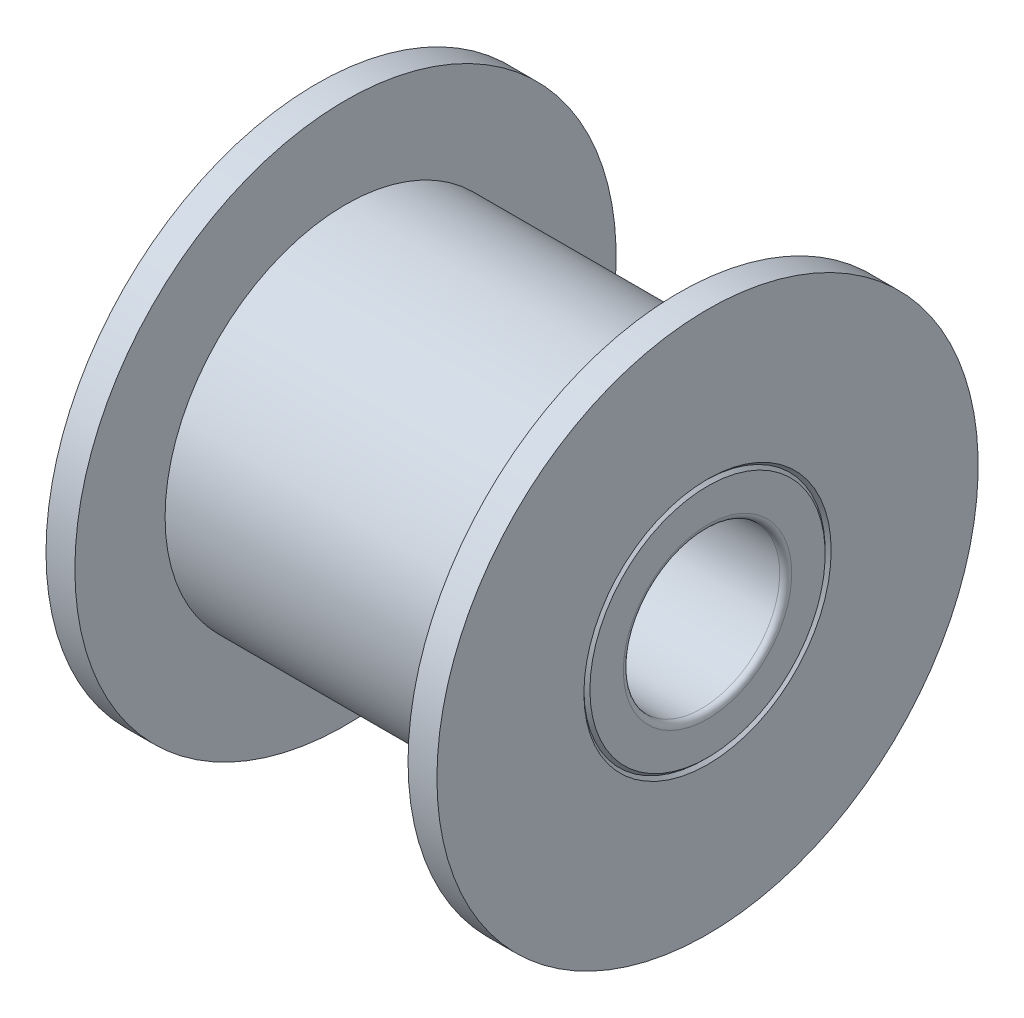
ISO-10303-21;
HEADER;
FILE_DESCRIPTION(('STEP AP214'),'2;1');
FILE_NAME('part.step','',(''),(''),'','','');
FILE_SCHEMA(('AUTOMOTIVE_DESIGN { 1 0 10303 214 1 1 1 1 }'));
ENDSEC;
DATA;
#1=APPLICATION_CONTEXT('core data for automotive mechanical design processes');
#2=APPLICATION_PROTOCOL_DEFINITION('international standard','automotive_design',2000,#1);
#3=PRODUCT_CONTEXT('',#1,'mechanical');
#4=PRODUCT('Part','Part','',(#3));
#5=PRODUCT_RELATED_PRODUCT_CATEGORY('part','',(#4));
#6=PRODUCT_DEFINITION_FORMATION('','',#4);
#7=PRODUCT_DEFINITION_CONTEXT('part definition',#1,'design');
#8=PRODUCT_DEFINITION('design','',#6,#7);
#9=PRODUCT_DEFINITION_SHAPE('','',#8);
#10=(LENGTH_UNIT() NAMED_UNIT(*) SI_UNIT(.MILLI.,.METRE.));
#11=(NAMED_UNIT(*) PLANE_ANGLE_UNIT() SI_UNIT($,.RADIAN.));
#12=(NAMED_UNIT(*) SI_UNIT($,.STERADIAN.) SOLID_ANGLE_UNIT());
#13=UNCERTAINTY_MEASURE_WITH_UNIT(LENGTH_MEASURE(1.E-05),#10,'distance_accuracy_value','');
#14=(GEOMETRIC_REPRESENTATION_CONTEXT(3) GLOBAL_UNCERTAINTY_ASSIGNED_CONTEXT((#13)) GLOBAL_UNIT_ASSIGNED_CONTEXT((#10,
#11,#12)) REPRESENTATION_CONTEXT('',''));
#15=CARTESIAN_POINT('',(0.,0.,0.));
#16=DIRECTION('',(0.,0.,1.));
#17=DIRECTION('',(1.,0.,0.));
#18=AXIS2_PLACEMENT_3D('',#15,#16,#17);
#19=CARTESIAN_POINT('',(0.999999999999998,-1.5,0.));
#20=DIRECTION('',(1.,0.,0.));
#21=DIRECTION('',(0.,0.,-1.));
#22=AXIS2_PLACEMENT_3D('',#19,#20,#21);
#23=CONICAL_SURFACE('',#22,3.88821661797057,0.911507190817284);
#24=CARTESIAN_POINT('',(1.08662837584799,-1.5,0.));
#25=DIRECTION('',(-1.,0.,0.));
#26=DIRECTION('',(0.,0.,1.));
#27=AXIS2_PLACEMENT_3D('',#24,#25,#26);
#28=CIRCLE('',#27,4.);
#29=CARTESIAN_POINT('',(1.08662837584799,-1.5,4.));
#30=VERTEX_POINT('',#29);
#31=EDGE_CURVE('E86',#30,#30,#28,.T.);
#32=ORIENTED_EDGE('',*,*,#31,.T.);
#33=EDGE_LOOP('',(#32));
#34=FACE_BOUND('',#33,.T.);
#35=CARTESIAN_POINT('',(0.999999999999998,-1.5,0.));
#36=DIRECTION('',(-1.,0.,0.));
#37=DIRECTION('',(0.,0.,1.));
#38=AXIS2_PLACEMENT_3D('',#35,#36,#37);
#39=CIRCLE('',#38,3.88821661797057);
#40=CARTESIAN_POINT('',(0.999999999999998,-1.5,3.88821661797057));
#41=VERTEX_POINT('',#40);
#42=EDGE_CURVE('E53',#41,#41,#39,.T.);
#43=ORIENTED_EDGE('',*,*,#42,.F.);
#44=EDGE_LOOP('',(#43));
#45=FACE_BOUND('',#44,.T.);
#46=ADVANCED_FACE('F33',(#34,#45),#23,.T.);
#47=CARTESIAN_POINT('',(1.,0.,0.));
#48=DIRECTION('',(1.,0.,0.));
#49=DIRECTION('',(0.,0.,-1.));
#50=AXIS2_PLACEMENT_3D('',#47,#48,#49);
#51=PLANE('',#50);
#52=CARTESIAN_POINT('',(1.,-1.5,0.));
#53=DIRECTION('',(1.,0.,0.));
#54=DIRECTION('',(0.,0.,-1.));
#55=AXIS2_PLACEMENT_3D('',#52,#53,#54);
#56=CIRCLE('',#55,2.8);
#57=CARTESIAN_POINT('',(1.,-1.5,-2.8));
#58=VERTEX_POINT('',#57);
#59=EDGE_CURVE('E10',#58,#58,#56,.T.);
#60=ORIENTED_EDGE('',*,*,#59,.T.);
#61=EDGE_LOOP('',(#60));
#62=FACE_BOUND('',#61,.T.);
#63=ORIENTED_EDGE('',*,*,#42,.T.);
#64=EDGE_LOOP('',(#63));
#65=FACE_BOUND('',#64,.T.);
#66=ADVANCED_FACE('F107',(#62,#65),#51,.F.);
#67=CARTESIAN_POINT('',(0.999999999999999,-1.5,0.));
#68=DIRECTION('',(-1.,0.,0.));
#69=DIRECTION('',(0.,0.,1.));
#70=AXIS2_PLACEMENT_3D('',#67,#68,#69);
#71=CYLINDRICAL_SURFACE('',#70,2.6);
#72=CARTESIAN_POINT('',(13.8,-1.5,0.));
#73=DIRECTION('',(-1.,0.,0.));
#74=DIRECTION('',(0.,0.,1.));
#75=AXIS2_PLACEMENT_3D('',#72,#73,#74);
#76=CIRCLE('',#75,2.6);
#77=CARTESIAN_POINT('',(13.8,-1.5,2.6));
#78=VERTEX_POINT('',#77);
#79=EDGE_CURVE('E40',#78,#78,#76,.F.);
#80=ORIENTED_EDGE('',*,*,#79,.T.);
#81=EDGE_LOOP('',(#80));
#82=FACE_BOUND('',#81,.T.);
#83=CARTESIAN_POINT('',(1.2,-1.5,0.));
#84=DIRECTION('',(1.,0.,0.));
#85=DIRECTION('',(0.,0.,-1.));
#86=AXIS2_PLACEMENT_3D('',#83,#84,#85);
#87=CIRCLE('',#86,2.6);
#88=CARTESIAN_POINT('',(1.2,-1.5,-2.6));
#89=VERTEX_POINT('',#88);
#90=EDGE_CURVE('E44',#89,#89,#87,.F.);
#91=ORIENTED_EDGE('',*,*,#90,.T.);
#92=EDGE_LOOP('',(#91));
#93=FACE_BOUND('',#92,.T.);
#94=ADVANCED_FACE('F112',(#82,#93),#71,.F.);
#95=CARTESIAN_POINT('',(14.,0.,0.));
#96=DIRECTION('',(-1.,0.,0.));
#97=DIRECTION('',(0.,0.,1.));
#98=AXIS2_PLACEMENT_3D('',#95,#96,#97);
#99=PLANE('',#98);
#100=CARTESIAN_POINT('',(14.,-1.5,0.));
#101=DIRECTION('',(-1.,0.,0.));
#102=DIRECTION('',(0.,0.,1.));
#103=AXIS2_PLACEMENT_3D('',#100,#101,#102);
#104=CIRCLE('',#103,2.8);
#105=CARTESIAN_POINT('',(14.,-1.5,2.8));
#106=VERTEX_POINT('',#105);
#107=EDGE_CURVE('E48',#106,#106,#104,.T.);
#108=ORIENTED_EDGE('',*,*,#107,.T.);
#109=EDGE_LOOP('',(#108));
#110=FACE_BOUND('',#109,.T.);
#111=CARTESIAN_POINT('',(14.,-1.5,0.));
#112=DIRECTION('',(-1.,0.,0.));
#113=DIRECTION('',(0.,0.,1.));
#114=AXIS2_PLACEMENT_3D('',#111,#112,#113);
#115=CIRCLE('',#114,3.91178338202943);
#116=CARTESIAN_POINT('',(14.,-1.5,3.91178338202943));
#117=VERTEX_POINT('',#116);
#118=EDGE_CURVE('E56',#117,#117,#115,.T.);
#119=ORIENTED_EDGE('',*,*,#118,.F.);
#120=EDGE_LOOP('',(#119));
#121=FACE_BOUND('',#120,.T.);
#122=ADVANCED_FACE('F117',(#110,#121),#99,.F.);
#123=CARTESIAN_POINT('',(14.,-1.5,0.));
#124=DIRECTION('',(-1.,0.,0.));
#125=DIRECTION('',(0.,0.,1.));
#126=AXIS2_PLACEMENT_3D('',#123,#124,#125);
#127=CONICAL_SURFACE('',#126,3.91178338202943,0.785398163397448);
#128=CARTESIAN_POINT('',(13.9,-1.5,0.));
#129=DIRECTION('',(-1.,0.,0.));
#130=DIRECTION('',(0.,0.,1.));
#131=AXIS2_PLACEMENT_3D('',#128,#129,#130);
#132=CIRCLE('',#131,4.01178338202943);
#133=CARTESIAN_POINT('',(13.9,-1.5,4.01178338202943));
#134=VERTEX_POINT('',#133);
#135=EDGE_CURVE('E59',#134,#134,#132,.T.);
#136=ORIENTED_EDGE('',*,*,#135,.F.);
#137=EDGE_LOOP('',(#136));
#138=FACE_BOUND('',#137,.T.);
#139=ORIENTED_EDGE('',*,*,#118,.T.);
#140=EDGE_LOOP('',(#139));
#141=FACE_BOUND('',#140,.T.);
#142=ADVANCED_FACE('F120',(#138,#141),#127,.T.);
#143=CARTESIAN_POINT('',(13.9,-1.5,0.));
#144=DIRECTION('',(1.,0.,0.));
#145=DIRECTION('',(0.,0.,-1.));
#146=AXIS2_PLACEMENT_3D('',#143,#144,#145);
#147=CONICAL_SURFACE('',#146,4.01178338202943,0.785398163397461);
#148=CARTESIAN_POINT('',(14.,-1.5,0.));
#149=DIRECTION('',(-1.,0.,0.));
#150=DIRECTION('',(0.,0.,1.));
#151=AXIS2_PLACEMENT_3D('',#148,#149,#150);
#152=CIRCLE('',#151,4.11178338202943);
#153=CARTESIAN_POINT('',(14.,-1.5,4.11178338202943));
#154=VERTEX_POINT('',#153);
#155=EDGE_CURVE('E62',#154,#154,#152,.T.);
#156=ORIENTED_EDGE('',*,*,#155,.F.);
#157=EDGE_LOOP('',(#156));
#158=FACE_BOUND('',#157,.T.);
#159=ORIENTED_EDGE('',*,*,#135,.T.);
#160=EDGE_LOOP('',(#159));
#161=FACE_BOUND('',#160,.T.);
#162=ADVANCED_FACE('F124',(#158,#161),#147,.F.);
#163=CARTESIAN_POINT('',(14.,0.,0.));
#164=DIRECTION('',(-1.,0.,0.));
#165=DIRECTION('',(0.,0.,1.));
#166=AXIS2_PLACEMENT_3D('',#163,#164,#165);
#167=PLANE('',#166);
#168=CARTESIAN_POINT('',(14.,-1.5,0.));
#169=DIRECTION('',(-1.,0.,0.));
#170=DIRECTION('',(0.,0.,1.));
#171=AXIS2_PLACEMENT_3D('',#168,#169,#170);
#172=CIRCLE('',#171,9.);
#173=CARTESIAN_POINT('',(14.,-1.5,9.));
#174=VERTEX_POINT('',#173);
#175=EDGE_CURVE('E65',#174,#174,#172,.T.);
#176=ORIENTED_EDGE('',*,*,#175,.F.);
#177=EDGE_LOOP('',(#176));
#178=FACE_BOUND('',#177,.T.);
#179=ORIENTED_EDGE('',*,*,#155,.T.);
#180=EDGE_LOOP('',(#179));
#181=FACE_BOUND('',#180,.T.);
#182=ADVANCED_FACE('F128',(#178,#181),#167,.F.);
#183=CARTESIAN_POINT('',(0.999999999999999,-1.5,0.));
#184=DIRECTION('',(-1.,0.,0.));
#185=DIRECTION('',(0.,0.,1.));
#186=AXIS2_PLACEMENT_3D('',#183,#184,#185);
#187=CYLINDRICAL_SURFACE('',#186,9.);
#188=ORIENTED_EDGE('',*,*,#175,.T.);
#189=EDGE_LOOP('',(#188));
#190=FACE_BOUND('',#189,.T.);
#191=CARTESIAN_POINT('',(13.04,-1.5,0.));
#192=DIRECTION('',(-1.,0.,0.));
#193=DIRECTION('',(0.,0.,1.));
#194=AXIS2_PLACEMENT_3D('',#191,#192,#193);
#195=CIRCLE('',#194,9.);
#196=CARTESIAN_POINT('',(13.04,-1.5,9.));
#197=VERTEX_POINT('',#196);
#198=EDGE_CURVE('E68',#197,#197,#195,.T.);
#199=ORIENTED_EDGE('',*,*,#198,.F.);
#200=EDGE_LOOP('',(#199));
#201=FACE_BOUND('',#200,.T.);
#202=ADVANCED_FACE('F132',(#190,#201),#187,.T.);
#203=CARTESIAN_POINT('',(13.04,0.,0.));
#204=DIRECTION('',(-1.,0.,0.));
#205=DIRECTION('',(0.,0.,1.));
#206=AXIS2_PLACEMENT_3D('',#203,#204,#205);
#207=PLANE('',#206);
#208=ORIENTED_EDGE('',*,*,#198,.T.);
#209=EDGE_LOOP('',(#208));
#210=FACE_BOUND('',#209,.T.);
#211=CARTESIAN_POINT('',(13.04,-1.5,0.));
#212=DIRECTION('',(-1.,0.,0.));
#213=DIRECTION('',(0.,0.,1.));
#214=AXIS2_PLACEMENT_3D('',#211,#212,#213);
#215=CIRCLE('',#214,6.);
#216=CARTESIAN_POINT('',(13.04,-1.5,6.));
#217=VERTEX_POINT('',#216);
#218=EDGE_CURVE('E71',#217,#217,#215,.T.);
#219=ORIENTED_EDGE('',*,*,#218,.F.);
#220=EDGE_LOOP('',(#219));
#221=FACE_BOUND('',#220,.T.);
#222=ADVANCED_FACE('F136',(#210,#221),#207,.T.);
#223=CARTESIAN_POINT('',(0.999999999999999,-1.5,0.));
#224=DIRECTION('',(-1.,0.,0.));
#225=DIRECTION('',(0.,0.,1.));
#226=AXIS2_PLACEMENT_3D('',#223,#224,#225);
#227=CYLINDRICAL_SURFACE('',#226,6.);
#228=ORIENTED_EDGE('',*,*,#218,.T.);
#229=EDGE_LOOP('',(#228));
#230=FACE_BOUND('',#229,.T.);
#231=CARTESIAN_POINT('',(1.96,-1.5,0.));
#232=DIRECTION('',(-1.,0.,0.));
#233=DIRECTION('',(0.,0.,1.));
#234=AXIS2_PLACEMENT_3D('',#231,#232,#233);
#235=CIRCLE('',#234,6.);
#236=CARTESIAN_POINT('',(1.96,-1.5,6.));
#237=VERTEX_POINT('',#236);
#238=EDGE_CURVE('E74',#237,#237,#235,.T.);
#239=ORIENTED_EDGE('',*,*,#238,.F.);
#240=EDGE_LOOP('',(#239));
#241=FACE_BOUND('',#240,.T.);
#242=ADVANCED_FACE('F140',(#230,#241),#227,.T.);
#243=CARTESIAN_POINT('',(1.96,0.,0.));
#244=DIRECTION('',(1.,0.,0.));
#245=DIRECTION('',(0.,0.,-1.));
#246=AXIS2_PLACEMENT_3D('',#243,#244,#245);
#247=PLANE('',#246);
#248=ORIENTED_EDGE('',*,*,#238,.T.);
#249=EDGE_LOOP('',(#248));
#250=FACE_BOUND('',#249,.T.);
#251=CARTESIAN_POINT('',(1.96,-1.5,0.));
#252=DIRECTION('',(-1.,0.,0.));
#253=DIRECTION('',(0.,0.,1.));
#254=AXIS2_PLACEMENT_3D('',#251,#252,#253);
#255=CIRCLE('',#254,9.);
#256=CARTESIAN_POINT('',(1.96,-1.5,9.));
#257=VERTEX_POINT('',#256);
#258=EDGE_CURVE('E77',#257,#257,#255,.T.);
#259=ORIENTED_EDGE('',*,*,#258,.F.);
#260=EDGE_LOOP('',(#259));
#261=FACE_BOUND('',#260,.T.);
#262=ADVANCED_FACE('F144',(#250,#261),#247,.T.);
#263=CARTESIAN_POINT('',(0.999999999999999,-1.5,0.));
#264=DIRECTION('',(-1.,0.,0.));
#265=DIRECTION('',(0.,0.,1.));
#266=AXIS2_PLACEMENT_3D('',#263,#264,#265);
#267=CYLINDRICAL_SURFACE('',#266,9.);
#268=ORIENTED_EDGE('',*,*,#258,.T.);
#269=EDGE_LOOP('',(#268));
#270=FACE_BOUND('',#269,.T.);
#271=CARTESIAN_POINT('',(1.,-1.5,0.));
#272=DIRECTION('',(-1.,0.,0.));
#273=DIRECTION('',(0.,0.,1.));
#274=AXIS2_PLACEMENT_3D('',#271,#272,#273);
#275=CIRCLE('',#274,9.);
#276=CARTESIAN_POINT('',(1.,-1.5,9.));
#277=VERTEX_POINT('',#276);
#278=EDGE_CURVE('E80',#277,#277,#275,.T.);
#279=ORIENTED_EDGE('',*,*,#278,.F.);
#280=EDGE_LOOP('',(#279));
#281=FACE_BOUND('',#280,.T.);
#282=ADVANCED_FACE('F103',(#270,#281),#267,.T.);
#283=CARTESIAN_POINT('',(0.999999999999999,0.,0.));
#284=DIRECTION('',(1.,0.,0.));
#285=DIRECTION('',(0.,0.,-1.));
#286=AXIS2_PLACEMENT_3D('',#283,#284,#285);
#287=PLANE('',#286);
#288=CARTESIAN_POINT('',(0.999999999999999,-1.5,0.));
#289=DIRECTION('',(-1.,0.,0.));
#290=DIRECTION('',(0.,0.,1.));
#291=AXIS2_PLACEMENT_3D('',#288,#289,#290);
#292=CIRCLE('',#291,4.11178338202943);
#293=CARTESIAN_POINT('',(0.999999999999999,-1.5,4.11178338202943));
#294=VERTEX_POINT('',#293);
#295=EDGE_CURVE('E83',#294,#294,#292,.T.);
#296=ORIENTED_EDGE('',*,*,#295,.F.);
#297=EDGE_LOOP('',(#296));
#298=FACE_BOUND('',#297,.T.);
#299=ORIENTED_EDGE('',*,*,#278,.T.);
#300=EDGE_LOOP('',(#299));
#301=FACE_BOUND('',#300,.T.);
#302=ADVANCED_FACE('F95',(#298,#301),#287,.F.);
#303=CARTESIAN_POINT('',(1.08662837584799,-1.5,0.));
#304=DIRECTION('',(-1.,0.,0.));
#305=DIRECTION('',(0.,0.,1.));
#306=AXIS2_PLACEMENT_3D('',#303,#304,#305);
#307=CONICAL_SURFACE('',#306,4.,0.911507190817285);
#308=ORIENTED_EDGE('',*,*,#295,.T.);
#309=EDGE_LOOP('',(#308));
#310=FACE_BOUND('',#309,.T.);
#311=ORIENTED_EDGE('',*,*,#31,.F.);
#312=EDGE_LOOP('',(#311));
#313=FACE_BOUND('',#312,.T.);
#314=ADVANCED_FACE('F92',(#310,#313),#307,.F.);
#315=CARTESIAN_POINT('',(13.8,-1.5,0.));
#316=DIRECTION('',(-1.,0.,0.));
#317=DIRECTION('',(0.,0.,1.));
#318=AXIS2_PLACEMENT_3D('',#315,#316,#317);
#319=TOROIDAL_SURFACE('',#318,2.8,0.2);
#320=ORIENTED_EDGE('',*,*,#79,.F.);
#321=EDGE_LOOP('',(#320));
#322=FACE_BOUND('',#321,.T.);
#323=ORIENTED_EDGE('',*,*,#107,.F.);
#324=EDGE_LOOP('',(#323));
#325=FACE_BOUND('',#324,.T.);
#326=ADVANCED_FACE('F94',(#322,#325),#319,.T.);
#327=CARTESIAN_POINT('',(1.2,-1.5,0.));
#328=DIRECTION('',(1.,0.,0.));
#329=DIRECTION('',(0.,0.,-1.));
#330=AXIS2_PLACEMENT_3D('',#327,#328,#329);
#331=TOROIDAL_SURFACE('',#330,2.8,0.2);
#332=ORIENTED_EDGE('',*,*,#59,.F.);
#333=EDGE_LOOP('',(#332));
#334=FACE_BOUND('',#333,.T.);
#335=ORIENTED_EDGE('',*,*,#90,.F.);
#336=EDGE_LOOP('',(#335));
#337=FACE_BOUND('',#336,.T.);
#338=ADVANCED_FACE('F35',(#334,#337),#331,.T.);
#339=CLOSED_SHELL('',(#46,#66,#94,#122,#142,#162,#182,#202,#222,#242,#262,#282,#302,#314,#326,#338));
#340=MANIFOLD_SOLID_BREP('B2',#339);
#341=ADVANCED_BREP_SHAPE_REPRESENTATION('',(#18,#340),#14);
#342=SHAPE_DEFINITION_REPRESENTATION(#9,#341);
ENDSEC;
END-ISO-10303-21;
